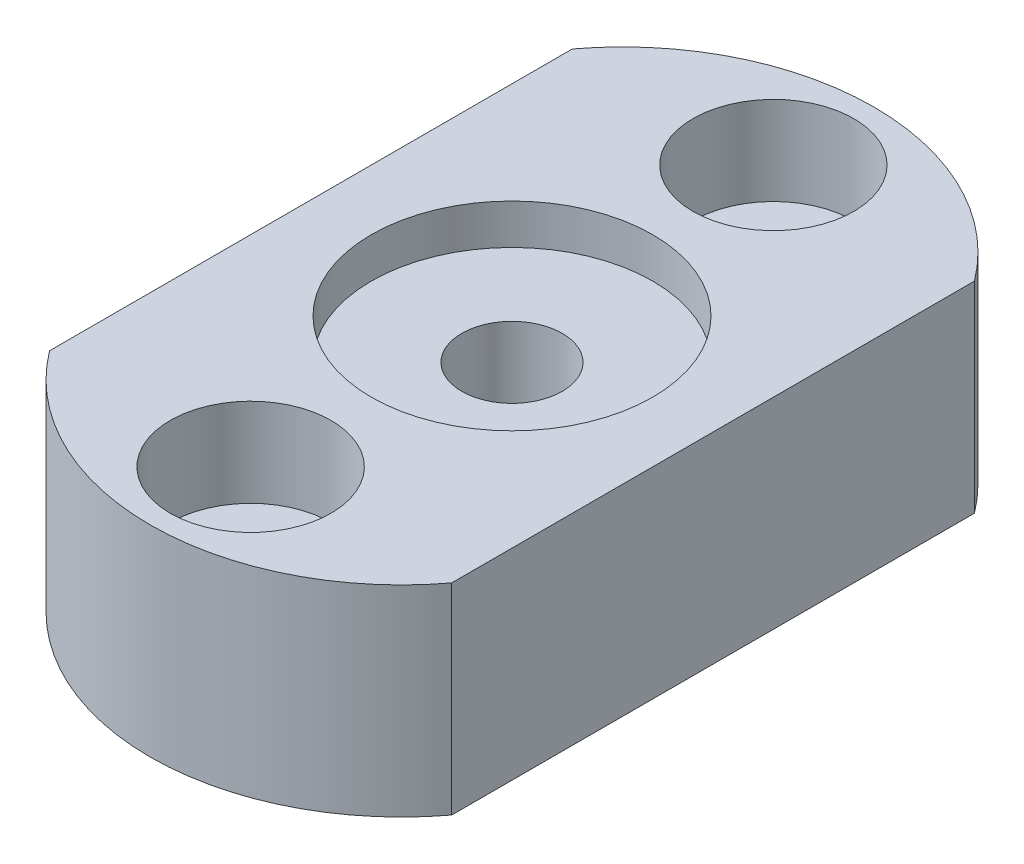
ISO-10303-21;
HEADER;
FILE_DESCRIPTION(('STEP AP214'),'2;1');
FILE_NAME('part.step','',(''),(''),'','','');
FILE_SCHEMA(('AUTOMOTIVE_DESIGN { 1 0 10303 214 1 1 1 1 }'));
ENDSEC;
DATA;
#1=APPLICATION_CONTEXT('core data for automotive mechanical design processes');
#2=APPLICATION_PROTOCOL_DEFINITION('international standard','automotive_design',2000,#1);
#3=PRODUCT_CONTEXT('',#1,'mechanical');
#4=PRODUCT('Part','Part','',(#3));
#5=PRODUCT_RELATED_PRODUCT_CATEGORY('part','',(#4));
#6=PRODUCT_DEFINITION_FORMATION('','',#4);
#7=PRODUCT_DEFINITION_CONTEXT('part definition',#1,'design');
#8=PRODUCT_DEFINITION('design','',#6,#7);
#9=PRODUCT_DEFINITION_SHAPE('','',#8);
#10=(LENGTH_UNIT() NAMED_UNIT(*) SI_UNIT(.MILLI.,.METRE.));
#11=(NAMED_UNIT(*) PLANE_ANGLE_UNIT() SI_UNIT($,.RADIAN.));
#12=(NAMED_UNIT(*) SI_UNIT($,.STERADIAN.) SOLID_ANGLE_UNIT());
#13=UNCERTAINTY_MEASURE_WITH_UNIT(LENGTH_MEASURE(1.E-05),#10,'distance_accuracy_value','');
#14=(GEOMETRIC_REPRESENTATION_CONTEXT(3) GLOBAL_UNCERTAINTY_ASSIGNED_CONTEXT((#13)) GLOBAL_UNIT_ASSIGNED_CONTEXT((#10,
#11,#12)) REPRESENTATION_CONTEXT('',''));
#15=CARTESIAN_POINT('',(0.,0.,0.));
#16=DIRECTION('',(0.,0.,1.));
#17=DIRECTION('',(1.,0.,0.));
#18=AXIS2_PLACEMENT_3D('',#15,#16,#17);
#19=CARTESIAN_POINT('',(0.,-0.000999999999999265,0.));
#20=DIRECTION('',(0.,1.,0.));
#21=DIRECTION('',(0.,0.,1.));
#22=AXIS2_PLACEMENT_3D('',#19,#20,#21);
#23=CYLINDRICAL_SURFACE('',#22,2.5);
#24=CARTESIAN_POINT('',(0.,8.,0.));
#25=DIRECTION('',(0.,1.,0.));
#26=DIRECTION('',(0.,0.,1.));
#27=AXIS2_PLACEMENT_3D('',#24,#25,#26);
#28=CIRCLE('',#27,2.5);
#29=CARTESIAN_POINT('',(0.,8.,2.5));
#30=VERTEX_POINT('',#29);
#31=EDGE_CURVE('E145',#30,#30,#28,.T.);
#32=ORIENTED_EDGE('',*,*,#31,.T.);
#33=EDGE_LOOP('',(#32));
#34=FACE_BOUND('',#33,.T.);
#35=CARTESIAN_POINT('',(0.,2.,0.));
#36=DIRECTION('',(0.,-1.,0.));
#37=DIRECTION('',(0.,0.,-1.));
#38=AXIS2_PLACEMENT_3D('',#35,#36,#37);
#39=CIRCLE('',#38,2.5);
#40=CARTESIAN_POINT('',(0.,2.,-2.5));
#41=VERTEX_POINT('',#40);
#42=EDGE_CURVE('E42',#41,#41,#39,.F.);
#43=ORIENTED_EDGE('',*,*,#42,.F.);
#44=EDGE_LOOP('',(#43));
#45=FACE_BOUND('',#44,.T.);
#46=ADVANCED_FACE('F38',(#34,#45),#23,.F.);
#47=CARTESIAN_POINT('',(0.,10.,5.49999999999998));
#48=DIRECTION('',(0.,-1.,0.));
#49=DIRECTION('',(0.,0.,-1.));
#50=AXIS2_PLACEMENT_3D('',#47,#48,#49);
#51=CYLINDRICAL_SURFACE('',#50,12.5);
#52=CARTESIAN_POINT('',(0.,0.,5.49999999999998));
#53=DIRECTION('',(0.,1.,0.));
#54=DIRECTION('',(0.,0.,-1.));
#55=AXIS2_PLACEMENT_3D('',#52,#53,#54);
#56=CIRCLE('',#55,12.5);
#57=CARTESIAN_POINT('',(-10.,0.,13.));
#58=VERTEX_POINT('',#57);
#59=CARTESIAN_POINT('',(10.,0.,13.));
#60=VERTEX_POINT('',#59);
#61=EDGE_CURVE('E104',#58,#60,#56,.T.);
#62=ORIENTED_EDGE('',*,*,#61,.T.);
#63=DIRECTION('',(0.,-1.,0.));
#64=VECTOR('',#63,1.);
#65=CARTESIAN_POINT('',(10.,10.,13.));
#66=LINE('',#65,#64);
#67=CARTESIAN_POINT('',(10.,10.,13.));
#68=VERTEX_POINT('',#67);
#69=EDGE_CURVE('E11',#68,#60,#66,.T.);
#70=ORIENTED_EDGE('',*,*,#69,.F.);
#71=CARTESIAN_POINT('',(0.,10.,5.49999999999998));
#72=DIRECTION('',(0.,1.,0.));
#73=DIRECTION('',(0.,0.,-1.));
#74=AXIS2_PLACEMENT_3D('',#71,#72,#73);
#75=CIRCLE('',#74,12.5);
#76=CARTESIAN_POINT('',(-10.,10.,13.));
#77=VERTEX_POINT('',#76);
#78=EDGE_CURVE('E91',#77,#68,#75,.T.);
#79=ORIENTED_EDGE('',*,*,#78,.F.);
#80=DIRECTION('',(0.,-1.,0.));
#81=VECTOR('',#80,1.);
#82=CARTESIAN_POINT('',(-10.,10.,13.));
#83=LINE('',#82,#81);
#84=EDGE_CURVE('E100',#77,#58,#83,.T.);
#85=ORIENTED_EDGE('',*,*,#84,.T.);
#86=EDGE_LOOP('',(#62,#70,#79,#85));
#87=FACE_BOUND('',#86,.T.);
#88=ADVANCED_FACE('F40',(#87),#51,.T.);
#89=CARTESIAN_POINT('',(10.,10.,-13.));
#90=DIRECTION('',(-1.,0.,0.));
#91=DIRECTION('',(0.,0.,1.));
#92=AXIS2_PLACEMENT_3D('',#89,#90,#91);
#93=PLANE('',#92);
#94=DIRECTION('',(0.,0.,-1.));
#95=VECTOR('',#94,1.);
#96=CARTESIAN_POINT('',(10.,0.,-13.));
#97=LINE('',#96,#95);
#98=CARTESIAN_POINT('',(10.,0.,-13.));
#99=VERTEX_POINT('',#98);
#100=EDGE_CURVE('E95',#60,#99,#97,.T.);
#101=ORIENTED_EDGE('',*,*,#100,.T.);
#102=DIRECTION('',(0.,-1.,0.));
#103=VECTOR('',#102,1.);
#104=CARTESIAN_POINT('',(10.,10.,-13.));
#105=LINE('',#104,#103);
#106=CARTESIAN_POINT('',(10.,10.,-13.));
#107=VERTEX_POINT('',#106);
#108=EDGE_CURVE('E48',#107,#99,#105,.T.);
#109=ORIENTED_EDGE('',*,*,#108,.F.);
#110=DIRECTION('',(0.,0.,-1.));
#111=VECTOR('',#110,1.);
#112=CARTESIAN_POINT('',(10.,10.,-13.));
#113=LINE('',#112,#111);
#114=EDGE_CURVE('E86',#68,#107,#113,.T.);
#115=ORIENTED_EDGE('',*,*,#114,.F.);
#116=ORIENTED_EDGE('',*,*,#69,.T.);
#117=EDGE_LOOP('',(#101,#109,#115,#116));
#118=FACE_BOUND('',#117,.T.);
#119=ADVANCED_FACE('F94',(#118),#93,.F.);
#120=CARTESIAN_POINT('',(0.,10.,-5.49999999999999));
#121=DIRECTION('',(0.,-1.,0.));
#122=DIRECTION('',(0.,0.,-1.));
#123=AXIS2_PLACEMENT_3D('',#120,#121,#122);
#124=CYLINDRICAL_SURFACE('',#123,12.5);
#125=CARTESIAN_POINT('',(0.,0.,-5.49999999999999));
#126=DIRECTION('',(0.,1.,0.));
#127=DIRECTION('',(0.,0.,-1.));
#128=AXIS2_PLACEMENT_3D('',#125,#126,#127);
#129=CIRCLE('',#128,12.5);
#130=CARTESIAN_POINT('',(-10.,0.,-13.));
#131=VERTEX_POINT('',#130);
#132=EDGE_CURVE('E73',#99,#131,#129,.T.);
#133=ORIENTED_EDGE('',*,*,#132,.T.);
#134=DIRECTION('',(0.,-1.,0.));
#135=VECTOR('',#134,1.);
#136=CARTESIAN_POINT('',(-10.,10.,-13.));
#137=LINE('',#136,#135);
#138=CARTESIAN_POINT('',(-10.,10.,-13.));
#139=VERTEX_POINT('',#138);
#140=EDGE_CURVE('E96',#139,#131,#137,.T.);
#141=ORIENTED_EDGE('',*,*,#140,.F.);
#142=CARTESIAN_POINT('',(0.,10.,-5.49999999999999));
#143=DIRECTION('',(0.,1.,0.));
#144=DIRECTION('',(0.,0.,-1.));
#145=AXIS2_PLACEMENT_3D('',#142,#143,#144);
#146=CIRCLE('',#145,12.5);
#147=EDGE_CURVE('E89',#107,#139,#146,.T.);
#148=ORIENTED_EDGE('',*,*,#147,.F.);
#149=ORIENTED_EDGE('',*,*,#108,.T.);
#150=EDGE_LOOP('',(#133,#141,#148,#149));
#151=FACE_BOUND('',#150,.T.);
#152=ADVANCED_FACE('F98',(#151),#124,.T.);
#153=CARTESIAN_POINT('',(-10.,10.,-13.));
#154=DIRECTION('',(1.,0.,0.));
#155=DIRECTION('',(0.,0.,-1.));
#156=AXIS2_PLACEMENT_3D('',#153,#154,#155);
#157=PLANE('',#156);
#158=DIRECTION('',(0.,0.,1.));
#159=VECTOR('',#158,1.);
#160=CARTESIAN_POINT('',(-10.,0.,-13.));
#161=LINE('',#160,#159);
#162=EDGE_CURVE('E79',#131,#58,#161,.T.);
#163=ORIENTED_EDGE('',*,*,#162,.T.);
#164=ORIENTED_EDGE('',*,*,#84,.F.);
#165=DIRECTION('',(0.,0.,1.));
#166=VECTOR('',#165,1.);
#167=CARTESIAN_POINT('',(-10.,10.,-13.));
#168=LINE('',#167,#166);
#169=EDGE_CURVE('E56',#139,#77,#168,.T.);
#170=ORIENTED_EDGE('',*,*,#169,.F.);
#171=ORIENTED_EDGE('',*,*,#140,.T.);
#172=EDGE_LOOP('',(#163,#164,#170,#171));
#173=FACE_BOUND('',#172,.T.);
#174=ADVANCED_FACE('F112',(#173),#157,.F.);
#175=CARTESIAN_POINT('',(0.,10.,5.49999999999998));
#176=DIRECTION('',(0.,-1.,0.));
#177=DIRECTION('',(0.,0.,-1.));
#178=AXIS2_PLACEMENT_3D('',#175,#176,#177);
#179=PLANE('',#178);
#180=CARTESIAN_POINT('',(0.,10.,0.));
#181=DIRECTION('',(0.,1.,0.));
#182=DIRECTION('',(0.,0.,1.));
#183=AXIS2_PLACEMENT_3D('',#180,#181,#182);
#184=CIRCLE('',#183,7.);
#185=CARTESIAN_POINT('',(0.,10.,7.));
#186=VERTEX_POINT('',#185);
#187=EDGE_CURVE('E142',#186,#186,#184,.T.);
#188=ORIENTED_EDGE('',*,*,#187,.F.);
#189=EDGE_LOOP('',(#188));
#190=FACE_BOUND('',#189,.T.);
#191=CARTESIAN_POINT('',(0.,10.,-13.));
#192=DIRECTION('',(0.,1.,0.));
#193=DIRECTION('',(0.,0.,1.));
#194=AXIS2_PLACEMENT_3D('',#191,#192,#193);
#195=CIRCLE('',#194,4.);
#196=CARTESIAN_POINT('',(0.,10.,-8.99999999999999));
#197=VERTEX_POINT('',#196);
#198=EDGE_CURVE('E125',#197,#197,#195,.T.);
#199=ORIENTED_EDGE('',*,*,#198,.F.);
#200=EDGE_LOOP('',(#199));
#201=FACE_BOUND('',#200,.T.);
#202=CARTESIAN_POINT('',(0.,10.,13.));
#203=DIRECTION('',(0.,1.,0.));
#204=DIRECTION('',(0.,0.,1.));
#205=AXIS2_PLACEMENT_3D('',#202,#203,#204);
#206=CIRCLE('',#205,4.);
#207=CARTESIAN_POINT('',(0.,10.,17.));
#208=VERTEX_POINT('',#207);
#209=EDGE_CURVE('E121',#208,#208,#206,.T.);
#210=ORIENTED_EDGE('',*,*,#209,.F.);
#211=EDGE_LOOP('',(#210));
#212=FACE_BOUND('',#211,.T.);
#213=ORIENTED_EDGE('',*,*,#78,.T.);
#214=ORIENTED_EDGE('',*,*,#114,.T.);
#215=ORIENTED_EDGE('',*,*,#147,.T.);
#216=ORIENTED_EDGE('',*,*,#169,.T.);
#217=EDGE_LOOP('',(#213,#214,#215,#216));
#218=FACE_BOUND('',#217,.T.);
#219=ADVANCED_FACE('F87',(#190,#201,#212,#218),#179,.F.);
#220=CARTESIAN_POINT('',(0.,0.,5.49999999999998));
#221=DIRECTION('',(0.,-1.,0.));
#222=DIRECTION('',(0.,0.,-1.));
#223=AXIS2_PLACEMENT_3D('',#220,#221,#222);
#224=PLANE('',#223);
#225=CARTESIAN_POINT('',(0.,0.,0.));
#226=DIRECTION('',(0.,-1.,0.));
#227=DIRECTION('',(0.,0.,-1.));
#228=AXIS2_PLACEMENT_3D('',#225,#226,#227);
#229=CIRCLE('',#228,7.);
#230=CARTESIAN_POINT('',(0.,0.,-7.));
#231=VERTEX_POINT('',#230);
#232=EDGE_CURVE('E150',#231,#231,#229,.T.);
#233=ORIENTED_EDGE('',*,*,#232,.F.);
#234=EDGE_LOOP('',(#233));
#235=FACE_BOUND('',#234,.T.);
#236=CARTESIAN_POINT('',(0.,0.,-13.));
#237=DIRECTION('',(0.,-1.,0.));
#238=DIRECTION('',(0.,0.,-1.));
#239=AXIS2_PLACEMENT_3D('',#236,#237,#238);
#240=CIRCLE('',#239,2.15);
#241=CARTESIAN_POINT('',(0.,0.,-15.15));
#242=VERTEX_POINT('',#241);
#243=EDGE_CURVE('E137',#242,#242,#240,.F.);
#244=ORIENTED_EDGE('',*,*,#243,.T.);
#245=EDGE_LOOP('',(#244));
#246=FACE_BOUND('',#245,.T.);
#247=CARTESIAN_POINT('',(0.,0.,13.));
#248=DIRECTION('',(0.,-1.,0.));
#249=DIRECTION('',(0.,0.,-1.));
#250=AXIS2_PLACEMENT_3D('',#247,#248,#249);
#251=CIRCLE('',#250,2.15);
#252=CARTESIAN_POINT('',(0.,0.,10.85));
#253=VERTEX_POINT('',#252);
#254=EDGE_CURVE('E133',#253,#253,#251,.F.);
#255=ORIENTED_EDGE('',*,*,#254,.T.);
#256=EDGE_LOOP('',(#255));
#257=FACE_BOUND('',#256,.T.);
#258=ORIENTED_EDGE('',*,*,#61,.F.);
#259=ORIENTED_EDGE('',*,*,#162,.F.);
#260=ORIENTED_EDGE('',*,*,#132,.F.);
#261=ORIENTED_EDGE('',*,*,#100,.F.);
#262=EDGE_LOOP('',(#258,#259,#260,#261));
#263=FACE_BOUND('',#262,.T.);
#264=ADVANCED_FACE('F115',(#235,#246,#257,#263),#224,.T.);
#265=CARTESIAN_POINT('',(0.,5.6,13.));
#266=DIRECTION('',(0.,1.,0.));
#267=DIRECTION('',(0.,0.,1.));
#268=AXIS2_PLACEMENT_3D('',#265,#266,#267);
#269=CYLINDRICAL_SURFACE('',#268,4.);
#270=CARTESIAN_POINT('',(0.,5.6,13.));
#271=DIRECTION('',(0.,1.,0.));
#272=DIRECTION('',(0.,0.,1.));
#273=AXIS2_PLACEMENT_3D('',#270,#271,#272);
#274=CIRCLE('',#273,4.);
#275=CARTESIAN_POINT('',(0.,5.6,17.));
#276=VERTEX_POINT('',#275);
#277=EDGE_CURVE('E118',#276,#276,#274,.T.);
#278=ORIENTED_EDGE('',*,*,#277,.F.);
#279=EDGE_LOOP('',(#278));
#280=FACE_BOUND('',#279,.T.);
#281=ORIENTED_EDGE('',*,*,#209,.T.);
#282=EDGE_LOOP('',(#281));
#283=FACE_BOUND('',#282,.T.);
#284=ADVANCED_FACE('F197',(#280,#283),#269,.F.);
#285=CARTESIAN_POINT('',(0.,5.6,13.));
#286=DIRECTION('',(0.,1.,0.));
#287=DIRECTION('',(0.,0.,1.));
#288=AXIS2_PLACEMENT_3D('',#285,#286,#287);
#289=PLANE('',#288);
#290=CARTESIAN_POINT('',(0.,5.6,13.));
#291=DIRECTION('',(0.,1.,0.));
#292=DIRECTION('',(0.,0.,1.));
#293=AXIS2_PLACEMENT_3D('',#290,#291,#292);
#294=CIRCLE('',#293,2.15);
#295=CARTESIAN_POINT('',(0.,5.6,15.15));
#296=VERTEX_POINT('',#295);
#297=EDGE_CURVE('E130',#296,#296,#294,.T.);
#298=ORIENTED_EDGE('',*,*,#297,.F.);
#299=EDGE_LOOP('',(#298));
#300=FACE_BOUND('',#299,.T.);
#301=ORIENTED_EDGE('',*,*,#277,.T.);
#302=EDGE_LOOP('',(#301));
#303=FACE_BOUND('',#302,.T.);
#304=ADVANCED_FACE('F195',(#300,#303),#289,.T.);
#305=CARTESIAN_POINT('',(0.,5.6,-13.));
#306=DIRECTION('',(0.,1.,0.));
#307=DIRECTION('',(0.,0.,1.));
#308=AXIS2_PLACEMENT_3D('',#305,#306,#307);
#309=CYLINDRICAL_SURFACE('',#308,4.);
#310=CARTESIAN_POINT('',(0.,5.6,-13.));
#311=DIRECTION('',(0.,1.,0.));
#312=DIRECTION('',(0.,0.,1.));
#313=AXIS2_PLACEMENT_3D('',#310,#311,#312);
#314=CIRCLE('',#313,4.);
#315=CARTESIAN_POINT('',(0.,5.6,-8.99999999999999));
#316=VERTEX_POINT('',#315);
#317=EDGE_CURVE('E107',#316,#316,#314,.T.);
#318=ORIENTED_EDGE('',*,*,#317,.F.);
#319=EDGE_LOOP('',(#318));
#320=FACE_BOUND('',#319,.T.);
#321=ORIENTED_EDGE('',*,*,#198,.T.);
#322=EDGE_LOOP('',(#321));
#323=FACE_BOUND('',#322,.T.);
#324=ADVANCED_FACE('F191',(#320,#323),#309,.F.);
#325=CARTESIAN_POINT('',(0.,5.6,-13.));
#326=DIRECTION('',(0.,1.,0.));
#327=DIRECTION('',(0.,0.,1.));
#328=AXIS2_PLACEMENT_3D('',#325,#326,#327);
#329=PLANE('',#328);
#330=CARTESIAN_POINT('',(0.,5.6,-13.));
#331=DIRECTION('',(0.,1.,0.));
#332=DIRECTION('',(0.,0.,1.));
#333=AXIS2_PLACEMENT_3D('',#330,#331,#332);
#334=CIRCLE('',#333,2.15);
#335=CARTESIAN_POINT('',(0.,5.6,-10.85));
#336=VERTEX_POINT('',#335);
#337=EDGE_CURVE('E122',#336,#336,#334,.T.);
#338=ORIENTED_EDGE('',*,*,#337,.F.);
#339=EDGE_LOOP('',(#338));
#340=FACE_BOUND('',#339,.T.);
#341=ORIENTED_EDGE('',*,*,#317,.T.);
#342=EDGE_LOOP('',(#341));
#343=FACE_BOUND('',#342,.T.);
#344=ADVANCED_FACE('F187',(#340,#343),#329,.T.);
#345=CARTESIAN_POINT('',(0.,-0.00100000000000013,13.));
#346=DIRECTION('',(0.,1.,0.));
#347=DIRECTION('',(0.,0.,1.));
#348=AXIS2_PLACEMENT_3D('',#345,#346,#347);
#349=CYLINDRICAL_SURFACE('',#348,2.15);
#350=ORIENTED_EDGE('',*,*,#254,.F.);
#351=EDGE_LOOP('',(#350));
#352=FACE_BOUND('',#351,.T.);
#353=ORIENTED_EDGE('',*,*,#297,.T.);
#354=EDGE_LOOP('',(#353));
#355=FACE_BOUND('',#354,.T.);
#356=ADVANCED_FACE('F183',(#352,#355),#349,.F.);
#357=CARTESIAN_POINT('',(0.,-0.00100000000000013,-13.));
#358=DIRECTION('',(0.,1.,0.));
#359=DIRECTION('',(0.,0.,1.));
#360=AXIS2_PLACEMENT_3D('',#357,#358,#359);
#361=CYLINDRICAL_SURFACE('',#360,2.15);
#362=ORIENTED_EDGE('',*,*,#243,.F.);
#363=EDGE_LOOP('',(#362));
#364=FACE_BOUND('',#363,.T.);
#365=ORIENTED_EDGE('',*,*,#337,.T.);
#366=EDGE_LOOP('',(#365));
#367=FACE_BOUND('',#366,.T.);
#368=ADVANCED_FACE('F179',(#364,#367),#361,.F.);
#369=CARTESIAN_POINT('',(0.,8.,0.));
#370=DIRECTION('',(0.,1.,0.));
#371=DIRECTION('',(0.,0.,1.));
#372=AXIS2_PLACEMENT_3D('',#369,#370,#371);
#373=CYLINDRICAL_SURFACE('',#372,7.);
#374=CARTESIAN_POINT('',(0.,8.,0.));
#375=DIRECTION('',(0.,1.,0.));
#376=DIRECTION('',(0.,0.,1.));
#377=AXIS2_PLACEMENT_3D('',#374,#375,#376);
#378=CIRCLE('',#377,7.);
#379=CARTESIAN_POINT('',(0.,8.,7.));
#380=VERTEX_POINT('',#379);
#381=EDGE_CURVE('E134',#380,#380,#378,.T.);
#382=ORIENTED_EDGE('',*,*,#381,.F.);
#383=EDGE_LOOP('',(#382));
#384=FACE_BOUND('',#383,.T.);
#385=ORIENTED_EDGE('',*,*,#187,.T.);
#386=EDGE_LOOP('',(#385));
#387=FACE_BOUND('',#386,.T.);
#388=ADVANCED_FACE('F175',(#384,#387),#373,.F.);
#389=CARTESIAN_POINT('',(0.,8.,0.));
#390=DIRECTION('',(0.,1.,0.));
#391=DIRECTION('',(0.,0.,1.));
#392=AXIS2_PLACEMENT_3D('',#389,#390,#391);
#393=PLANE('',#392);
#394=ORIENTED_EDGE('',*,*,#31,.F.);
#395=EDGE_LOOP('',(#394));
#396=FACE_BOUND('',#395,.T.);
#397=ORIENTED_EDGE('',*,*,#381,.T.);
#398=EDGE_LOOP('',(#397));
#399=FACE_BOUND('',#398,.T.);
#400=ADVANCED_FACE('F172',(#396,#399),#393,.T.);
#401=CARTESIAN_POINT('',(0.,2.,0.));
#402=DIRECTION('',(0.,-1.,0.));
#403=DIRECTION('',(0.,0.,-1.));
#404=AXIS2_PLACEMENT_3D('',#401,#402,#403);
#405=PLANE('',#404);
#406=CARTESIAN_POINT('',(0.,2.,0.));
#407=DIRECTION('',(0.,-1.,0.));
#408=DIRECTION('',(0.,0.,-1.));
#409=AXIS2_PLACEMENT_3D('',#406,#407,#408);
#410=CIRCLE('',#409,7.);
#411=CARTESIAN_POINT('',(0.,2.,-7.));
#412=VERTEX_POINT('',#411);
#413=EDGE_CURVE('E153',#412,#412,#410,.T.);
#414=ORIENTED_EDGE('',*,*,#413,.T.);
#415=EDGE_LOOP('',(#414));
#416=FACE_BOUND('',#415,.T.);
#417=ORIENTED_EDGE('',*,*,#42,.T.);
#418=EDGE_LOOP('',(#417));
#419=FACE_BOUND('',#418,.T.);
#420=ADVANCED_FACE('F160',(#416,#419),#405,.T.);
#421=CARTESIAN_POINT('',(0.,2.,0.));
#422=DIRECTION('',(0.,-1.,0.));
#423=DIRECTION('',(0.,0.,-1.));
#424=AXIS2_PLACEMENT_3D('',#421,#422,#423);
#425=CYLINDRICAL_SURFACE('',#424,7.);
#426=ORIENTED_EDGE('',*,*,#413,.F.);
#427=EDGE_LOOP('',(#426));
#428=FACE_BOUND('',#427,.T.);
#429=ORIENTED_EDGE('',*,*,#232,.T.);
#430=EDGE_LOOP('',(#429));
#431=FACE_BOUND('',#430,.T.);
#432=ADVANCED_FACE('F170',(#428,#431),#425,.F.);
#433=CLOSED_SHELL('',(#46,#88,#119,#152,#174,#219,#264,#284,#304,#324,#344,#356,#368,#388,#400,
#420,#432));
#434=MANIFOLD_SOLID_BREP('B2',#433);
#435=ADVANCED_BREP_SHAPE_REPRESENTATION('',(#18,#434),#14);
#436=SHAPE_DEFINITION_REPRESENTATION(#9,#435);
ENDSEC;
END-ISO-10303-21;
